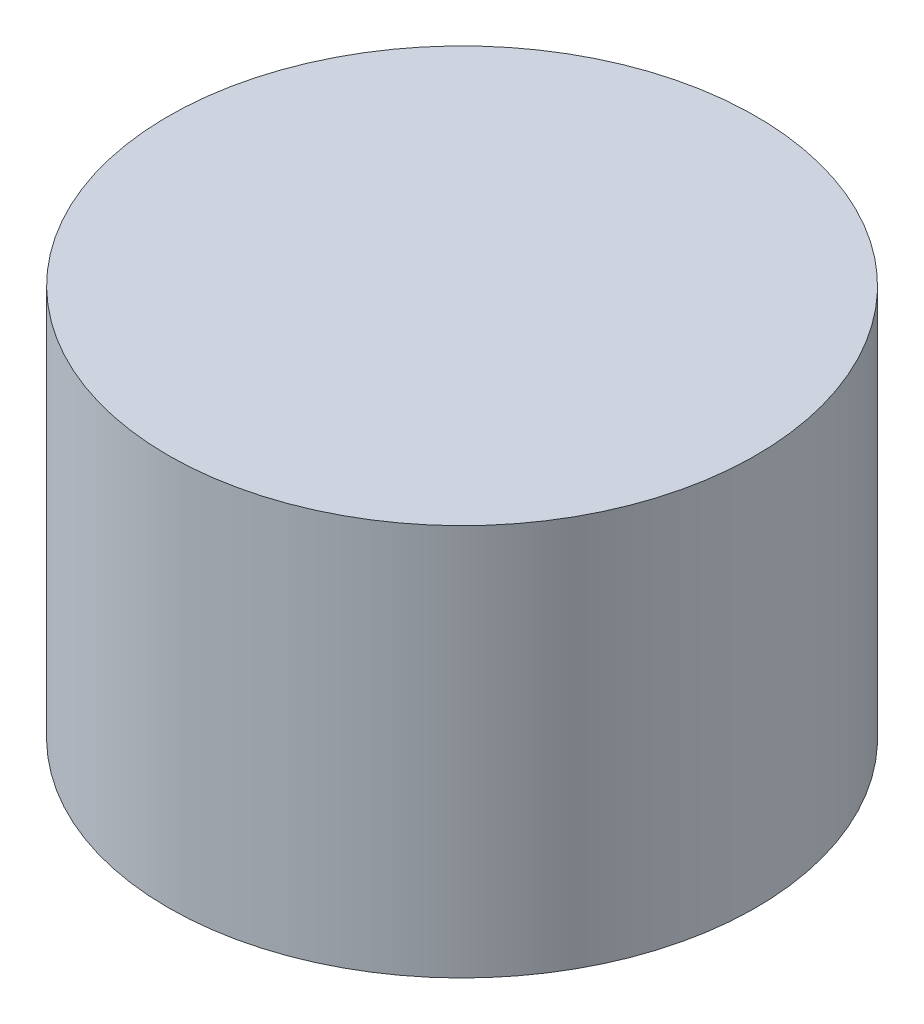
ISO-10303-21;
HEADER;
FILE_DESCRIPTION(('STEP AP214'),'2;1');
FILE_NAME('part.step','',(''),(''),'','','');
FILE_SCHEMA(('AUTOMOTIVE_DESIGN { 1 0 10303 214 1 1 1 1 }'));
ENDSEC;
DATA;
#1=APPLICATION_CONTEXT('core data for automotive mechanical design processes');
#2=APPLICATION_PROTOCOL_DEFINITION('international standard','automotive_design',2000,#1);
#3=PRODUCT_CONTEXT('',#1,'mechanical');
#4=PRODUCT('Part','Part','',(#3));
#5=PRODUCT_RELATED_PRODUCT_CATEGORY('part','',(#4));
#6=PRODUCT_DEFINITION_FORMATION('','',#4);
#7=PRODUCT_DEFINITION_CONTEXT('part definition',#1,'design');
#8=PRODUCT_DEFINITION('design','',#6,#7);
#9=PRODUCT_DEFINITION_SHAPE('','',#8);
#10=(LENGTH_UNIT() NAMED_UNIT(*) SI_UNIT(.MILLI.,.METRE.));
#11=(NAMED_UNIT(*) PLANE_ANGLE_UNIT() SI_UNIT($,.RADIAN.));
#12=(NAMED_UNIT(*) SI_UNIT($,.STERADIAN.) SOLID_ANGLE_UNIT());
#13=UNCERTAINTY_MEASURE_WITH_UNIT(LENGTH_MEASURE(1.E-05),#10,'distance_accuracy_value','');
#14=(GEOMETRIC_REPRESENTATION_CONTEXT(3) GLOBAL_UNCERTAINTY_ASSIGNED_CONTEXT((#13)) GLOBAL_UNIT_ASSIGNED_CONTEXT((#10,
#11,#12)) REPRESENTATION_CONTEXT('',''));
#15=CARTESIAN_POINT('',(0.,0.,0.));
#16=DIRECTION('',(0.,0.,1.));
#17=DIRECTION('',(1.,0.,0.));
#18=AXIS2_PLACEMENT_3D('',#15,#16,#17);
#19=CARTESIAN_POINT('',(0.,12.,0.));
#20=DIRECTION('',(0.,-1.,0.));
#21=DIRECTION('',(0.,0.,-1.));
#22=AXIS2_PLACEMENT_3D('',#19,#20,#21);
#23=CYLINDRICAL_SURFACE('',#22,9.);
#24=CARTESIAN_POINT('',(0.,12.,0.));
#25=DIRECTION('',(0.,1.,0.));
#26=DIRECTION('',(0.,0.,1.));
#27=AXIS2_PLACEMENT_3D('',#24,#25,#26);
#28=CIRCLE('',#27,9.);
#29=CARTESIAN_POINT('',(0.,12.,9.));
#30=VERTEX_POINT('',#29);
#31=EDGE_CURVE('E10',#30,#30,#28,.T.);
#32=ORIENTED_EDGE('',*,*,#31,.F.);
#33=EDGE_LOOP('',(#32));
#34=FACE_BOUND('',#33,.T.);
#35=CARTESIAN_POINT('',(0.,0.,0.));
#36=DIRECTION('',(0.,1.,0.));
#37=DIRECTION('',(0.,0.,1.));
#38=AXIS2_PLACEMENT_3D('',#35,#36,#37);
#39=CIRCLE('',#38,9.);
#40=CARTESIAN_POINT('',(0.,0.,9.));
#41=VERTEX_POINT('',#40);
#42=EDGE_CURVE('E35',#41,#41,#39,.T.);
#43=ORIENTED_EDGE('',*,*,#42,.T.);
#44=EDGE_LOOP('',(#43));
#45=FACE_BOUND('',#44,.T.);
#46=ADVANCED_FACE('F32',(#34,#45),#23,.T.);
#47=CARTESIAN_POINT('',(0.,12.,0.));
#48=DIRECTION('',(0.,1.,0.));
#49=DIRECTION('',(0.,0.,1.));
#50=AXIS2_PLACEMENT_3D('',#47,#48,#49);
#51=PLANE('',#50);
#52=ORIENTED_EDGE('',*,*,#31,.T.);
#53=EDGE_LOOP('',(#52));
#54=FACE_BOUND('',#53,.T.);
#55=ADVANCED_FACE('F47',(#54),#51,.T.);
#56=CARTESIAN_POINT('',(0.,0.,0.));
#57=DIRECTION('',(0.,1.,0.));
#58=DIRECTION('',(0.,0.,1.));
#59=AXIS2_PLACEMENT_3D('',#56,#57,#58);
#60=PLANE('',#59);
#61=ORIENTED_EDGE('',*,*,#42,.F.);
#62=EDGE_LOOP('',(#61));
#63=FACE_BOUND('',#62,.T.);
#64=ADVANCED_FACE('F45',(#63),#60,.F.);
#65=CLOSED_SHELL('',(#46,#55,#64));
#66=MANIFOLD_SOLID_BREP('B2',#65);
#67=ADVANCED_BREP_SHAPE_REPRESENTATION('',(#18,#66),#14);
#68=SHAPE_DEFINITION_REPRESENTATION(#9,#67);
ENDSEC;
END-ISO-10303-21;
